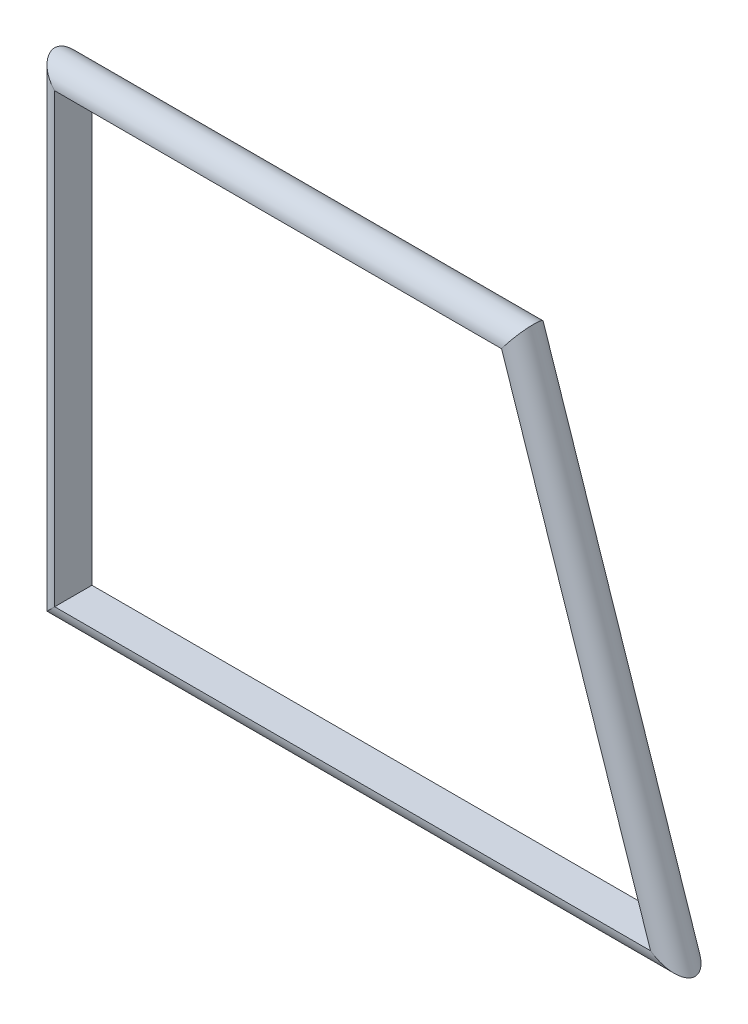
ISO-10303-21;
HEADER;
FILE_DESCRIPTION(('STEP AP214'),'2;1');
FILE_NAME('part.step','',(''),(''),'','','');
FILE_SCHEMA(('AUTOMOTIVE_DESIGN { 1 0 10303 214 1 1 1 1 }'));
ENDSEC;
DATA;
#1=APPLICATION_CONTEXT('core data for automotive mechanical design processes');
#2=APPLICATION_PROTOCOL_DEFINITION('international standard','automotive_design',2000,#1);
#3=PRODUCT_CONTEXT('',#1,'mechanical');
#4=PRODUCT('Part','Part','',(#3));
#5=PRODUCT_RELATED_PRODUCT_CATEGORY('part','',(#4));
#6=PRODUCT_DEFINITION_FORMATION('','',#4);
#7=PRODUCT_DEFINITION_CONTEXT('part definition',#1,'design');
#8=PRODUCT_DEFINITION('design','',#6,#7);
#9=PRODUCT_DEFINITION_SHAPE('','',#8);
#10=(LENGTH_UNIT() NAMED_UNIT(*) SI_UNIT(.MILLI.,.METRE.));
#11=(NAMED_UNIT(*) PLANE_ANGLE_UNIT() SI_UNIT($,.RADIAN.));
#12=(NAMED_UNIT(*) SI_UNIT($,.STERADIAN.) SOLID_ANGLE_UNIT());
#13=UNCERTAINTY_MEASURE_WITH_UNIT(LENGTH_MEASURE(1.E-05),#10,'distance_accuracy_value','');
#14=(GEOMETRIC_REPRESENTATION_CONTEXT(3) GLOBAL_UNCERTAINTY_ASSIGNED_CONTEXT((#13)) GLOBAL_UNIT_ASSIGNED_CONTEXT((#10,
#11,#12)) REPRESENTATION_CONTEXT('',''));
#15=CARTESIAN_POINT('',(0.,0.,0.));
#16=DIRECTION('',(0.,0.,1.));
#17=DIRECTION('',(1.,0.,0.));
#18=AXIS2_PLACEMENT_3D('',#15,#16,#17);
#19=CARTESIAN_POINT('',(1.,0.,0.025));
#20=DIRECTION('',(0.,1.,0.));
#21=DIRECTION('',(0.,0.,1.));
#22=AXIS2_PLACEMENT_3D('',#19,#20,#21);
#23=PLANE('',#22);
#24=DIRECTION('',(-1.,0.,0.));
#25=VECTOR('',#24,1.);
#26=CARTESIAN_POINT('',(1.,0.,-0.025));
#27=LINE('',#26,#25);
#28=CARTESIAN_POINT('',(0.8,0.,-0.025));
#29=VERTEX_POINT('',#28);
#30=CARTESIAN_POINT('',(0.,0.,-0.025));
#31=VERTEX_POINT('',#30);
#32=EDGE_CURVE('E36',#29,#31,#27,.T.);
#33=ORIENTED_EDGE('',*,*,#32,.T.);
#34=DIRECTION('',(0.,0.,1.));
#35=VECTOR('',#34,1.);
#36=CARTESIAN_POINT('',(0.,0.,0.025));
#37=LINE('',#36,#35);
#38=CARTESIAN_POINT('',(0.,0.,0.025));
#39=VERTEX_POINT('',#38);
#40=EDGE_CURVE('E70',#31,#39,#37,.T.);
#41=ORIENTED_EDGE('',*,*,#40,.T.);
#42=DIRECTION('',(-1.,0.,0.));
#43=VECTOR('',#42,1.);
#44=CARTESIAN_POINT('',(1.,0.,0.025));
#45=LINE('',#44,#43);
#46=CARTESIAN_POINT('',(0.8,0.,0.025));
#47=VERTEX_POINT('',#46);
#48=EDGE_CURVE('E79',#47,#39,#45,.T.);
#49=ORIENTED_EDGE('',*,*,#48,.F.);
#50=DIRECTION('',(0.,0.,1.));
#51=VECTOR('',#50,1.);
#52=CARTESIAN_POINT('',(0.8,0.,0.025));
#53=LINE('',#52,#51);
#54=EDGE_CURVE('E85',#29,#47,#53,.T.);
#55=ORIENTED_EDGE('',*,*,#54,.F.);
#56=EDGE_LOOP('',(#33,#41,#49,#55));
#57=FACE_BOUND('',#56,.T.);
#58=ADVANCED_FACE('F33',(#57),#23,.T.);
#59=CARTESIAN_POINT('',(1.,0.,0.));
#60=DIRECTION('',(-1.,0.,0.));
#61=DIRECTION('',(0.,0.,1.));
#62=AXIS2_PLACEMENT_3D('',#59,#60,#61);
#63=CYLINDRICAL_SURFACE('',#62,0.025);
#64=ORIENTED_EDGE('',*,*,#48,.T.);
#65=CARTESIAN_POINT('',(0.,0.,0.));
#66=DIRECTION('',(-0.707106781186548,0.707106781186548,0.));
#67=DIRECTION('',(0.707106781186548,0.707106781186548,0.));
#68=AXIS2_PLACEMENT_3D('',#65,#66,#67);
#69=ELLIPSE('',#68,0.0353553390593274,0.025);
#70=EDGE_CURVE('E75',#39,#31,#69,.F.);
#71=ORIENTED_EDGE('',*,*,#70,.T.);
#72=ORIENTED_EDGE('',*,*,#32,.F.);
#73=CARTESIAN_POINT('',(0.8,0.,0.));
#74=DIRECTION('',(-0.584710284663765,-0.811242185175561,0.));
#75=DIRECTION('',(0.811242185175561,-0.584710284663765,0.));
#76=AXIS2_PLACEMENT_3D('',#73,#74,#75);
#77=ELLIPSE('',#76,0.0427562173194476,0.025);
#78=EDGE_CURVE('E109',#47,#29,#77,.F.);
#79=ORIENTED_EDGE('',*,*,#78,.F.);
#80=EDGE_LOOP('',(#64,#71,#72,#79));
#81=FACE_BOUND('',#80,.T.);
#82=ADVANCED_FACE('F76',(#81),#63,.T.);
#83=CARTESIAN_POINT('',(0.,-0.2,0.025));
#84=DIRECTION('',(1.,0.,0.));
#85=DIRECTION('',(0.,0.,-1.));
#86=AXIS2_PLACEMENT_3D('',#83,#84,#85);
#87=PLANE('',#86);
#88=DIRECTION('',(0.,1.,0.));
#89=VECTOR('',#88,1.);
#90=CARTESIAN_POINT('',(0.,-0.2,-0.025));
#91=LINE('',#90,#89);
#92=CARTESIAN_POINT('',(0.,0.6,-0.025));
#93=VERTEX_POINT('',#92);
#94=EDGE_CURVE('E91',#31,#93,#91,.T.);
#95=ORIENTED_EDGE('',*,*,#94,.T.);
#96=DIRECTION('',(0.,0.,1.));
#97=VECTOR('',#96,1.);
#98=CARTESIAN_POINT('',(0.,0.6,0.025));
#99=LINE('',#98,#97);
#100=CARTESIAN_POINT('',(0.,0.6,0.025));
#101=VERTEX_POINT('',#100);
#102=EDGE_CURVE('E110',#93,#101,#99,.T.);
#103=ORIENTED_EDGE('',*,*,#102,.T.);
#104=DIRECTION('',(0.,1.,0.));
#105=VECTOR('',#104,1.);
#106=CARTESIAN_POINT('',(0.,-0.2,0.025));
#107=LINE('',#106,#105);
#108=EDGE_CURVE('E93',#39,#101,#107,.T.);
#109=ORIENTED_EDGE('',*,*,#108,.F.);
#110=ORIENTED_EDGE('',*,*,#40,.F.);
#111=EDGE_LOOP('',(#95,#103,#109,#110));
#112=FACE_BOUND('',#111,.T.);
#113=ADVANCED_FACE('F89',(#112),#87,.T.);
#114=CARTESIAN_POINT('',(0.,-0.2,0.));
#115=DIRECTION('',(0.,1.,0.));
#116=DIRECTION('',(0.,0.,1.));
#117=AXIS2_PLACEMENT_3D('',#114,#115,#116);
#118=CYLINDRICAL_SURFACE('',#117,0.025);
#119=ORIENTED_EDGE('',*,*,#108,.T.);
#120=CARTESIAN_POINT('',(0.,0.6,0.));
#121=DIRECTION('',(0.707106781186547,0.707106781186548,0.));
#122=DIRECTION('',(0.707106781186548,-0.707106781186547,0.));
#123=AXIS2_PLACEMENT_3D('',#120,#121,#122);
#124=ELLIPSE('',#123,0.0353553390593274,0.025);
#125=EDGE_CURVE('E98',#101,#93,#124,.F.);
#126=ORIENTED_EDGE('',*,*,#125,.T.);
#127=ORIENTED_EDGE('',*,*,#94,.F.);
#128=ORIENTED_EDGE('',*,*,#70,.F.);
#129=EDGE_LOOP('',(#119,#126,#127,#128));
#130=FACE_BOUND('',#129,.T.);
#131=ADVANCED_FACE('F96',(#130),#118,.T.);
#132=CARTESIAN_POINT('',(0.536754446796633,0.789736659610103,0.025));
#133=DIRECTION('',(-0.948683298050514,-0.316227766016838,0.));
#134=DIRECTION('',(0.316227766016838,-0.948683298050514,0.));
#135=AXIS2_PLACEMENT_3D('',#132,#133,#134);
#136=PLANE('',#135);
#137=DIRECTION('',(0.316227766016838,-0.948683298050514,0.));
#138=VECTOR('',#137,1.);
#139=CARTESIAN_POINT('',(0.536754446796633,0.789736659610103,-0.025));
#140=LINE('',#139,#138);
#141=CARTESIAN_POINT('',(0.6,0.6,-0.025));
#142=VERTEX_POINT('',#141);
#143=EDGE_CURVE('E101',#142,#29,#140,.T.);
#144=ORIENTED_EDGE('',*,*,#143,.T.);
#145=ORIENTED_EDGE('',*,*,#54,.T.);
#146=DIRECTION('',(0.316227766016838,-0.948683298050514,0.));
#147=VECTOR('',#146,1.);
#148=CARTESIAN_POINT('',(0.536754446796633,0.789736659610103,0.025));
#149=LINE('',#148,#147);
#150=CARTESIAN_POINT('',(0.6,0.6,0.025));
#151=VERTEX_POINT('',#150);
#152=EDGE_CURVE('E99',#151,#47,#149,.T.);
#153=ORIENTED_EDGE('',*,*,#152,.F.);
#154=DIRECTION('',(0.,0.,1.));
#155=VECTOR('',#154,1.);
#156=CARTESIAN_POINT('',(0.6,0.6,0.025));
#157=LINE('',#156,#155);
#158=EDGE_CURVE('E132',#142,#151,#157,.T.);
#159=ORIENTED_EDGE('',*,*,#158,.F.);
#160=EDGE_LOOP('',(#144,#145,#153,#159));
#161=FACE_BOUND('',#160,.T.);
#162=ADVANCED_FACE('F107',(#161),#136,.T.);
#163=CARTESIAN_POINT('',(0.536754446796633,0.789736659610103,0.));
#164=DIRECTION('',(0.316227766016838,-0.948683298050514,0.));
#165=DIRECTION('',(0.948683298050514,0.316227766016838,0.));
#166=AXIS2_PLACEMENT_3D('',#163,#164,#165);
#167=CYLINDRICAL_SURFACE('',#166,0.025);
#168=ORIENTED_EDGE('',*,*,#152,.T.);
#169=ORIENTED_EDGE('',*,*,#78,.T.);
#170=ORIENTED_EDGE('',*,*,#143,.F.);
#171=CARTESIAN_POINT('',(0.6,0.6,0.));
#172=DIRECTION('',(0.811242185175561,-0.584710284663765,0.));
#173=DIRECTION('',(0.584710284663765,0.811242185175561,0.));
#174=AXIS2_PLACEMENT_3D('',#171,#172,#173);
#175=ELLIPSE('',#174,0.0308169378477153,0.025);
#176=EDGE_CURVE('E51',#151,#142,#175,.F.);
#177=ORIENTED_EDGE('',*,*,#176,.F.);
#178=EDGE_LOOP('',(#168,#169,#170,#177));
#179=FACE_BOUND('',#178,.T.);
#180=ADVANCED_FACE('F112',(#179),#167,.T.);
#181=CARTESIAN_POINT('',(-0.2,0.6,0.025));
#182=DIRECTION('',(0.,-1.,0.));
#183=DIRECTION('',(1.,0.,0.));
#184=AXIS2_PLACEMENT_3D('',#181,#182,#183);
#185=PLANE('',#184);
#186=ORIENTED_EDGE('',*,*,#102,.F.);
#187=DIRECTION('',(1.,0.,0.));
#188=VECTOR('',#187,1.);
#189=CARTESIAN_POINT('',(-0.2,0.6,-0.025));
#190=LINE('',#189,#188);
#191=EDGE_CURVE('E11',#93,#142,#190,.T.);
#192=ORIENTED_EDGE('',*,*,#191,.T.);
#193=ORIENTED_EDGE('',*,*,#158,.T.);
#194=DIRECTION('',(1.,0.,0.));
#195=VECTOR('',#194,1.);
#196=CARTESIAN_POINT('',(-0.2,0.6,0.025));
#197=LINE('',#196,#195);
#198=EDGE_CURVE('E42',#101,#151,#197,.T.);
#199=ORIENTED_EDGE('',*,*,#198,.F.);
#200=EDGE_LOOP('',(#186,#192,#193,#199));
#201=FACE_BOUND('',#200,.T.);
#202=ADVANCED_FACE('F114',(#201),#185,.T.);
#203=CARTESIAN_POINT('',(-0.2,0.6,0.));
#204=DIRECTION('',(1.,0.,0.));
#205=DIRECTION('',(0.,1.,0.));
#206=AXIS2_PLACEMENT_3D('',#203,#204,#205);
#207=CYLINDRICAL_SURFACE('',#206,0.025);
#208=ORIENTED_EDGE('',*,*,#125,.F.);
#209=ORIENTED_EDGE('',*,*,#198,.T.);
#210=ORIENTED_EDGE('',*,*,#176,.T.);
#211=ORIENTED_EDGE('',*,*,#191,.F.);
#212=EDGE_LOOP('',(#208,#209,#210,#211));
#213=FACE_BOUND('',#212,.T.);
#214=ADVANCED_FACE('F120',(#213),#207,.T.);
#215=CLOSED_SHELL('',(#58,#82,#113,#131,#162,#180,#202,#214));
#216=MANIFOLD_SOLID_BREP('B2',#215);
#217=ADVANCED_BREP_SHAPE_REPRESENTATION('',(#18,#216),#14);
#218=SHAPE_DEFINITION_REPRESENTATION(#9,#217);
ENDSEC;
END-ISO-10303-21;
